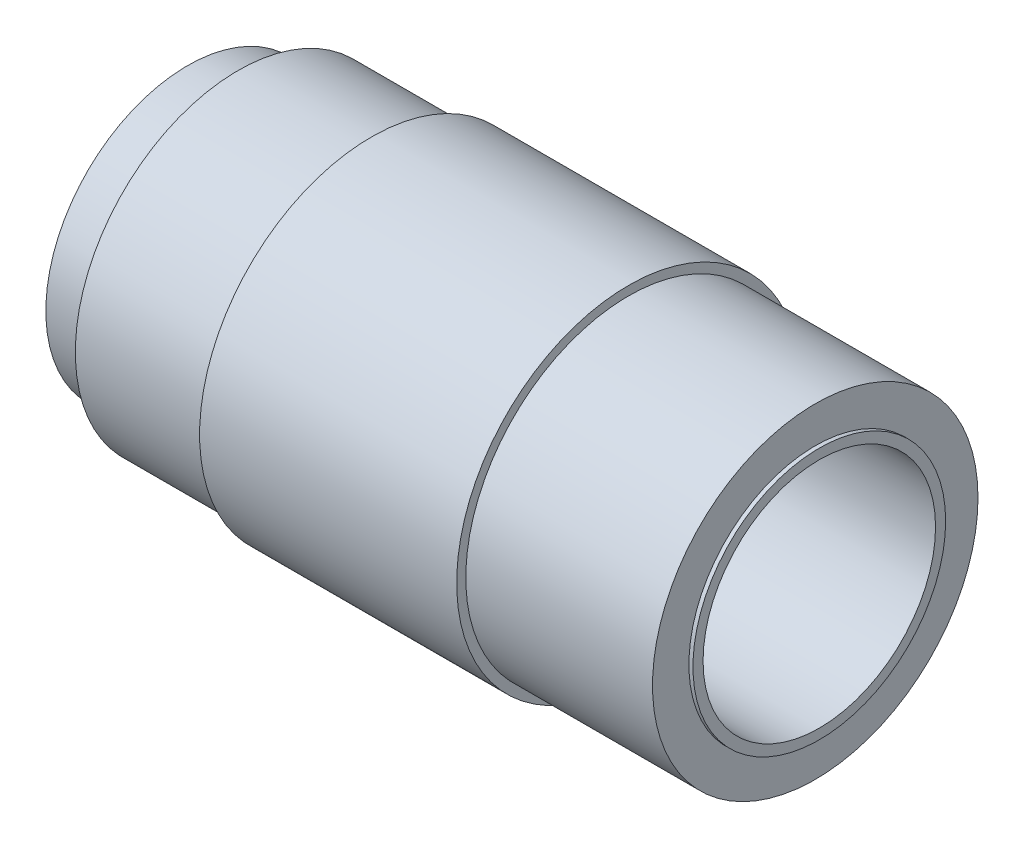
ISO-10303-21;
HEADER;
FILE_DESCRIPTION(('STEP AP214'),'2;1');
FILE_NAME('part.step','',(''),(''),'','','');
FILE_SCHEMA(('AUTOMOTIVE_DESIGN { 1 0 10303 214 1 1 1 1 }'));
ENDSEC;
DATA;
#1=APPLICATION_CONTEXT('core data for automotive mechanical design processes');
#2=APPLICATION_PROTOCOL_DEFINITION('international standard','automotive_design',2000,#1);
#3=PRODUCT_CONTEXT('',#1,'mechanical');
#4=PRODUCT('Part','Part','',(#3));
#5=PRODUCT_RELATED_PRODUCT_CATEGORY('part','',(#4));
#6=PRODUCT_DEFINITION_FORMATION('','',#4);
#7=PRODUCT_DEFINITION_CONTEXT('part definition',#1,'design');
#8=PRODUCT_DEFINITION('design','',#6,#7);
#9=PRODUCT_DEFINITION_SHAPE('','',#8);
#10=(LENGTH_UNIT() NAMED_UNIT(*) SI_UNIT(.MILLI.,.METRE.));
#11=(NAMED_UNIT(*) PLANE_ANGLE_UNIT() SI_UNIT($,.RADIAN.));
#12=(NAMED_UNIT(*) SI_UNIT($,.STERADIAN.) SOLID_ANGLE_UNIT());
#13=UNCERTAINTY_MEASURE_WITH_UNIT(LENGTH_MEASURE(1.E-05),#10,'distance_accuracy_value','');
#14=(GEOMETRIC_REPRESENTATION_CONTEXT(3) GLOBAL_UNCERTAINTY_ASSIGNED_CONTEXT((#13)) GLOBAL_UNIT_ASSIGNED_CONTEXT((#10,
#11,#12)) REPRESENTATION_CONTEXT('',''));
#15=CARTESIAN_POINT('',(0.,0.,0.));
#16=DIRECTION('',(0.,0.,1.));
#17=DIRECTION('',(1.,0.,0.));
#18=AXIS2_PLACEMENT_3D('',#15,#16,#17);
#19=CARTESIAN_POINT('',(0.,0.,0.));
#20=DIRECTION('',(1.,0.,0.));
#21=DIRECTION('',(0.,0.,-1.));
#22=AXIS2_PLACEMENT_3D('',#19,#20,#21);
#23=CYLINDRICAL_SURFACE('',#22,12.5);
#24=CARTESIAN_POINT('',(-37.9,0.,0.));
#25=DIRECTION('',(1.,0.,0.));
#26=DIRECTION('',(0.,0.,-1.));
#27=AXIS2_PLACEMENT_3D('',#24,#25,#26);
#28=CIRCLE('',#27,12.5);
#29=CARTESIAN_POINT('',(-37.9,0.,-12.5));
#30=VERTEX_POINT('',#29);
#31=EDGE_CURVE('E70',#30,#30,#28,.T.);
#32=ORIENTED_EDGE('',*,*,#31,.T.);
#33=EDGE_LOOP('',(#32));
#34=FACE_BOUND('',#33,.T.);
#35=CARTESIAN_POINT('',(-37.5,0.,0.));
#36=DIRECTION('',(1.,0.,0.));
#37=DIRECTION('',(0.,0.,-1.));
#38=AXIS2_PLACEMENT_3D('',#35,#36,#37);
#39=CIRCLE('',#38,12.5);
#40=CARTESIAN_POINT('',(-37.5,0.,-12.5));
#41=VERTEX_POINT('',#40);
#42=EDGE_CURVE('E10',#41,#41,#39,.T.);
#43=ORIENTED_EDGE('',*,*,#42,.F.);
#44=EDGE_LOOP('',(#43));
#45=FACE_BOUND('',#44,.T.);
#46=ADVANCED_FACE('F30',(#34,#45),#23,.T.);
#47=CARTESIAN_POINT('',(-37.5,0.,-12.5));
#48=DIRECTION('',(1.,0.,0.));
#49=DIRECTION('',(0.,0.,-1.));
#50=AXIS2_PLACEMENT_3D('',#47,#48,#49);
#51=PLANE('',#50);
#52=ORIENTED_EDGE('',*,*,#42,.T.);
#53=EDGE_LOOP('',(#52));
#54=FACE_BOUND('',#53,.T.);
#55=CARTESIAN_POINT('',(-37.5,0.,0.));
#56=DIRECTION('',(1.,0.,0.));
#57=DIRECTION('',(0.,0.,-1.));
#58=AXIS2_PLACEMENT_3D('',#55,#56,#57);
#59=CIRCLE('',#58,11.5);
#60=CARTESIAN_POINT('',(-37.5,0.,-11.5));
#61=VERTEX_POINT('',#60);
#62=EDGE_CURVE('E36',#61,#61,#59,.T.);
#63=ORIENTED_EDGE('',*,*,#62,.F.);
#64=EDGE_LOOP('',(#63));
#65=FACE_BOUND('',#64,.T.);
#66=ADVANCED_FACE('F88',(#54,#65),#51,.T.);
#67=CARTESIAN_POINT('',(0.,0.,0.));
#68=DIRECTION('',(1.,0.,0.));
#69=DIRECTION('',(0.,0.,-1.));
#70=AXIS2_PLACEMENT_3D('',#67,#68,#69);
#71=CYLINDRICAL_SURFACE('',#70,11.5);
#72=ORIENTED_EDGE('',*,*,#62,.T.);
#73=EDGE_LOOP('',(#72));
#74=FACE_BOUND('',#73,.T.);
#75=CARTESIAN_POINT('',(-100.,0.,0.));
#76=DIRECTION('',(1.,0.,0.));
#77=DIRECTION('',(0.,0.,-1.));
#78=AXIS2_PLACEMENT_3D('',#75,#76,#77);
#79=CIRCLE('',#78,11.5);
#80=CARTESIAN_POINT('',(-100.,0.,-11.5));
#81=VERTEX_POINT('',#80);
#82=EDGE_CURVE('E40',#81,#81,#79,.T.);
#83=ORIENTED_EDGE('',*,*,#82,.F.);
#84=EDGE_LOOP('',(#83));
#85=FACE_BOUND('',#84,.T.);
#86=ADVANCED_FACE('F92',(#74,#85),#71,.F.);
#87=CARTESIAN_POINT('',(-100.,0.,-14.0176435101942));
#88=DIRECTION('',(-1.,0.,0.));
#89=DIRECTION('',(0.,0.,1.));
#90=AXIS2_PLACEMENT_3D('',#87,#88,#89);
#91=PLANE('',#90);
#92=ORIENTED_EDGE('',*,*,#82,.T.);
#93=EDGE_LOOP('',(#92));
#94=FACE_BOUND('',#93,.T.);
#95=CARTESIAN_POINT('',(-100.,0.,0.));
#96=DIRECTION('',(1.,0.,0.));
#97=DIRECTION('',(0.,0.,-1.));
#98=AXIS2_PLACEMENT_3D('',#95,#96,#97);
#99=CIRCLE('',#98,14.0176435101942);
#100=CARTESIAN_POINT('',(-100.,0.,-14.0176435101942));
#101=VERTEX_POINT('',#100);
#102=EDGE_CURVE('E44',#101,#101,#99,.T.);
#103=ORIENTED_EDGE('',*,*,#102,.F.);
#104=EDGE_LOOP('',(#103));
#105=FACE_BOUND('',#104,.T.);
#106=ADVANCED_FACE('F96',(#94,#105),#91,.T.);
#107=CARTESIAN_POINT('',(0.,0.,0.));
#108=DIRECTION('',(1.,0.,0.));
#109=DIRECTION('',(0.,0.,-1.));
#110=AXIS2_PLACEMENT_3D('',#107,#108,#109);
#111=CYLINDRICAL_SURFACE('',#110,14.0176435101942);
#112=ORIENTED_EDGE('',*,*,#102,.T.);
#113=EDGE_LOOP('',(#112));
#114=FACE_BOUND('',#113,.T.);
#115=CARTESIAN_POINT('',(-95.,0.,0.));
#116=DIRECTION('',(1.,0.,0.));
#117=DIRECTION('',(0.,0.,-1.));
#118=AXIS2_PLACEMENT_3D('',#115,#116,#117);
#119=CIRCLE('',#118,14.0176435101942);
#120=CARTESIAN_POINT('',(-95.,0.,-14.0176435101942));
#121=VERTEX_POINT('',#120);
#122=EDGE_CURVE('E49',#121,#121,#119,.T.);
#123=ORIENTED_EDGE('',*,*,#122,.F.);
#124=EDGE_LOOP('',(#123));
#125=FACE_BOUND('',#124,.T.);
#126=ADVANCED_FACE('F102',(#114,#125),#111,.T.);
#127=CARTESIAN_POINT('',(-95.,0.,-16.1));
#128=DIRECTION('',(-1.,0.,0.));
#129=DIRECTION('',(0.,0.,1.));
#130=AXIS2_PLACEMENT_3D('',#127,#128,#129);
#131=PLANE('',#130);
#132=ORIENTED_EDGE('',*,*,#122,.T.);
#133=EDGE_LOOP('',(#132));
#134=FACE_BOUND('',#133,.T.);
#135=CARTESIAN_POINT('',(-95.,0.,0.));
#136=DIRECTION('',(1.,0.,0.));
#137=DIRECTION('',(0.,0.,-1.));
#138=AXIS2_PLACEMENT_3D('',#135,#136,#137);
#139=CIRCLE('',#138,16.1);
#140=CARTESIAN_POINT('',(-95.,0.,-16.1));
#141=VERTEX_POINT('',#140);
#142=EDGE_CURVE('E52',#141,#141,#139,.T.);
#143=ORIENTED_EDGE('',*,*,#142,.F.);
#144=EDGE_LOOP('',(#143));
#145=FACE_BOUND('',#144,.T.);
#146=ADVANCED_FACE('F106',(#134,#145),#131,.T.);
#147=CARTESIAN_POINT('',(0.,0.,0.));
#148=DIRECTION('',(1.,0.,0.));
#149=DIRECTION('',(0.,0.,-1.));
#150=AXIS2_PLACEMENT_3D('',#147,#148,#149);
#151=CYLINDRICAL_SURFACE('',#150,16.1);
#152=ORIENTED_EDGE('',*,*,#142,.T.);
#153=EDGE_LOOP('',(#152));
#154=FACE_BOUND('',#153,.T.);
#155=CARTESIAN_POINT('',(-81.8084684105679,0.,0.));
#156=DIRECTION('',(1.,0.,0.));
#157=DIRECTION('',(0.,0.,-1.));
#158=AXIS2_PLACEMENT_3D('',#155,#156,#157);
#159=CIRCLE('',#158,16.1);
#160=CARTESIAN_POINT('',(-81.8084684105679,0.,-16.1));
#161=VERTEX_POINT('',#160);
#162=EDGE_CURVE('E55',#161,#161,#159,.T.);
#163=ORIENTED_EDGE('',*,*,#162,.F.);
#164=EDGE_LOOP('',(#163));
#165=FACE_BOUND('',#164,.T.);
#166=ADVANCED_FACE('F110',(#154,#165),#151,.T.);
#167=CARTESIAN_POINT('',(-81.8084684105679,0.,-17.));
#168=DIRECTION('',(-1.,0.,0.));
#169=DIRECTION('',(0.,0.,1.));
#170=AXIS2_PLACEMENT_3D('',#167,#168,#169);
#171=PLANE('',#170);
#172=ORIENTED_EDGE('',*,*,#162,.T.);
#173=EDGE_LOOP('',(#172));
#174=FACE_BOUND('',#173,.T.);
#175=CARTESIAN_POINT('',(-81.8084684105679,0.,0.));
#176=DIRECTION('',(1.,0.,0.));
#177=DIRECTION('',(0.,0.,-1.));
#178=AXIS2_PLACEMENT_3D('',#175,#176,#177);
#179=CIRCLE('',#178,17.);
#180=CARTESIAN_POINT('',(-81.8084684105679,0.,-17.));
#181=VERTEX_POINT('',#180);
#182=EDGE_CURVE('E58',#181,#181,#179,.T.);
#183=ORIENTED_EDGE('',*,*,#182,.F.);
#184=EDGE_LOOP('',(#183));
#185=FACE_BOUND('',#184,.T.);
#186=ADVANCED_FACE('F114',(#174,#185),#171,.T.);
#187=CARTESIAN_POINT('',(0.,0.,0.));
#188=DIRECTION('',(1.,0.,0.));
#189=DIRECTION('',(0.,0.,-1.));
#190=AXIS2_PLACEMENT_3D('',#187,#188,#189);
#191=CYLINDRICAL_SURFACE('',#190,17.);
#192=ORIENTED_EDGE('',*,*,#182,.T.);
#193=EDGE_LOOP('',(#192));
#194=FACE_BOUND('',#193,.T.);
#195=CARTESIAN_POINT('',(-56.3734329238762,0.,0.));
#196=DIRECTION('',(1.,0.,0.));
#197=DIRECTION('',(0.,0.,-1.));
#198=AXIS2_PLACEMENT_3D('',#195,#196,#197);
#199=CIRCLE('',#198,17.);
#200=CARTESIAN_POINT('',(-56.3734329238762,0.,-17.));
#201=VERTEX_POINT('',#200);
#202=EDGE_CURVE('E61',#201,#201,#199,.T.);
#203=ORIENTED_EDGE('',*,*,#202,.F.);
#204=EDGE_LOOP('',(#203));
#205=FACE_BOUND('',#204,.T.);
#206=ADVANCED_FACE('F118',(#194,#205),#191,.T.);
#207=CARTESIAN_POINT('',(-56.3734329238762,0.,-16.1));
#208=DIRECTION('',(1.,0.,0.));
#209=DIRECTION('',(0.,0.,-1.));
#210=AXIS2_PLACEMENT_3D('',#207,#208,#209);
#211=PLANE('',#210);
#212=ORIENTED_EDGE('',*,*,#202,.T.);
#213=EDGE_LOOP('',(#212));
#214=FACE_BOUND('',#213,.T.);
#215=CARTESIAN_POINT('',(-56.3734329238762,0.,0.));
#216=DIRECTION('',(1.,0.,0.));
#217=DIRECTION('',(0.,0.,-1.));
#218=AXIS2_PLACEMENT_3D('',#215,#216,#217);
#219=CIRCLE('',#218,16.1);
#220=CARTESIAN_POINT('',(-56.3734329238762,0.,-16.1));
#221=VERTEX_POINT('',#220);
#222=EDGE_CURVE('E64',#221,#221,#219,.T.);
#223=ORIENTED_EDGE('',*,*,#222,.F.);
#224=EDGE_LOOP('',(#223));
#225=FACE_BOUND('',#224,.T.);
#226=ADVANCED_FACE('F84',(#214,#225),#211,.T.);
#227=CARTESIAN_POINT('',(0.,0.,0.));
#228=DIRECTION('',(1.,0.,0.));
#229=DIRECTION('',(0.,0.,-1.));
#230=AXIS2_PLACEMENT_3D('',#227,#228,#229);
#231=CYLINDRICAL_SURFACE('',#230,16.1);
#232=ORIENTED_EDGE('',*,*,#222,.T.);
#233=EDGE_LOOP('',(#232));
#234=FACE_BOUND('',#233,.T.);
#235=CARTESIAN_POINT('',(-37.9,0.,0.));
#236=DIRECTION('',(1.,0.,0.));
#237=DIRECTION('',(0.,0.,-1.));
#238=AXIS2_PLACEMENT_3D('',#235,#236,#237);
#239=CIRCLE('',#238,16.1);
#240=CARTESIAN_POINT('',(-37.9,0.,-16.1));
#241=VERTEX_POINT('',#240);
#242=EDGE_CURVE('E67',#241,#241,#239,.T.);
#243=ORIENTED_EDGE('',*,*,#242,.F.);
#244=EDGE_LOOP('',(#243));
#245=FACE_BOUND('',#244,.T.);
#246=ADVANCED_FACE('F78',(#234,#245),#231,.T.);
#247=CARTESIAN_POINT('',(-37.9,0.,-12.5));
#248=DIRECTION('',(1.,0.,0.));
#249=DIRECTION('',(0.,0.,-1.));
#250=AXIS2_PLACEMENT_3D('',#247,#248,#249);
#251=PLANE('',#250);
#252=ORIENTED_EDGE('',*,*,#242,.T.);
#253=EDGE_LOOP('',(#252));
#254=FACE_BOUND('',#253,.T.);
#255=ORIENTED_EDGE('',*,*,#31,.F.);
#256=EDGE_LOOP('',(#255));
#257=FACE_BOUND('',#256,.T.);
#258=ADVANCED_FACE('F76',(#254,#257),#251,.T.);
#259=CLOSED_SHELL('',(#46,#66,#86,#106,#126,#146,#166,#186,#206,#226,#246,#258));
#260=MANIFOLD_SOLID_BREP('B2',#259);
#261=ADVANCED_BREP_SHAPE_REPRESENTATION('',(#18,#260),#14);
#262=SHAPE_DEFINITION_REPRESENTATION(#9,#261);
ENDSEC;
END-ISO-10303-21;
